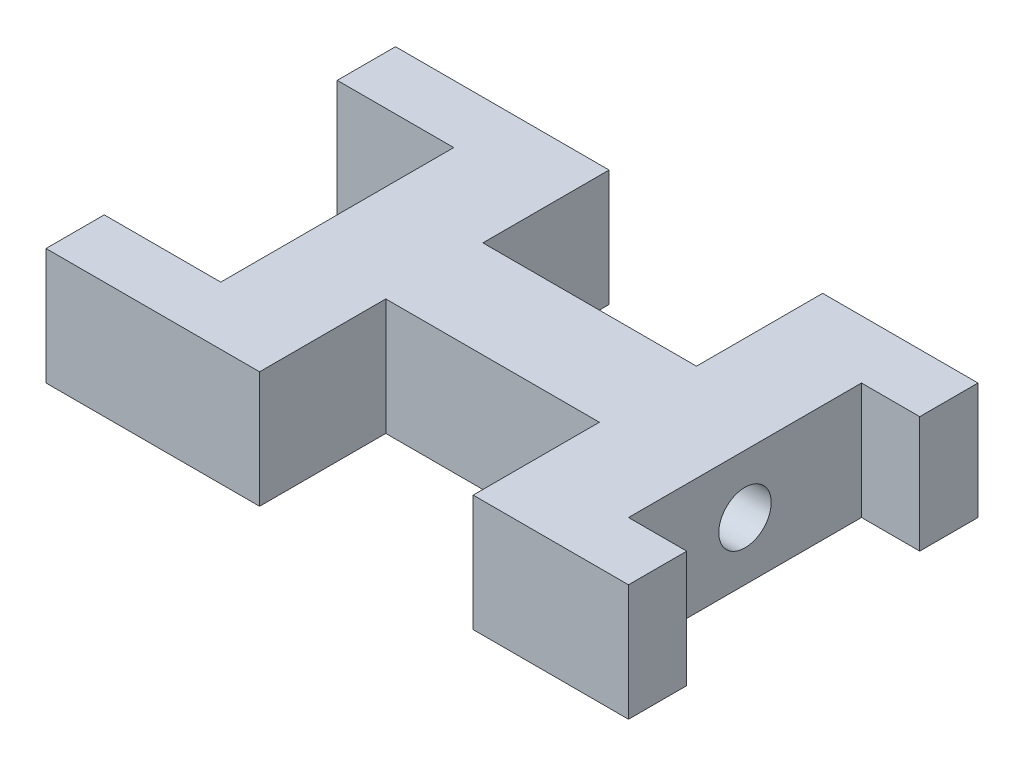
ISO-10303-21;
HEADER;
FILE_DESCRIPTION(('STEP AP214'),'2;1');
FILE_NAME('part.step','',(''),(''),'','','');
FILE_SCHEMA(('AUTOMOTIVE_DESIGN { 1 0 10303 214 1 1 1 1 }'));
ENDSEC;
DATA;
#1=APPLICATION_CONTEXT('core data for automotive mechanical design processes');
#2=APPLICATION_PROTOCOL_DEFINITION('international standard','automotive_design',2000,#1);
#3=PRODUCT_CONTEXT('',#1,'mechanical');
#4=PRODUCT('Part','Part','',(#3));
#5=PRODUCT_RELATED_PRODUCT_CATEGORY('part','',(#4));
#6=PRODUCT_DEFINITION_FORMATION('','',#4);
#7=PRODUCT_DEFINITION_CONTEXT('part definition',#1,'design');
#8=PRODUCT_DEFINITION('design','',#6,#7);
#9=PRODUCT_DEFINITION_SHAPE('','',#8);
#10=(LENGTH_UNIT() NAMED_UNIT(*) SI_UNIT(.MILLI.,.METRE.));
#11=(NAMED_UNIT(*) PLANE_ANGLE_UNIT() SI_UNIT($,.RADIAN.));
#12=(NAMED_UNIT(*) SI_UNIT($,.STERADIAN.) SOLID_ANGLE_UNIT());
#13=UNCERTAINTY_MEASURE_WITH_UNIT(LENGTH_MEASURE(1.E-05),#10,'distance_accuracy_value','');
#14=(GEOMETRIC_REPRESENTATION_CONTEXT(3) GLOBAL_UNCERTAINTY_ASSIGNED_CONTEXT((#13)) GLOBAL_UNIT_ASSIGNED_CONTEXT((#10,
#11,#12)) REPRESENTATION_CONTEXT('',''));
#15=CARTESIAN_POINT('',(0.,0.,0.));
#16=DIRECTION('',(0.,0.,1.));
#17=DIRECTION('',(1.,0.,0.));
#18=AXIS2_PLACEMENT_3D('',#15,#16,#17);
#19=CARTESIAN_POINT('',(-10.5,6.,0.));
#20=DIRECTION('',(1.,0.,0.));
#21=DIRECTION('',(0.,0.,-1.));
#22=AXIS2_PLACEMENT_3D('',#19,#20,#21);
#23=PLANE('',#22);
#24=CARTESIAN_POINT('',(-10.5,3.,0.));
#25=DIRECTION('',(1.,0.,0.));
#26=DIRECTION('',(0.,0.,-1.));
#27=AXIS2_PLACEMENT_3D('',#24,#25,#26);
#28=CIRCLE('',#27,1.35);
#29=CARTESIAN_POINT('',(-10.5,3.,-1.35000000000001));
#30=VERTEX_POINT('',#29);
#31=EDGE_CURVE('E203',#30,#30,#28,.T.);
#32=ORIENTED_EDGE('',*,*,#31,.T.);
#33=EDGE_LOOP('',(#32));
#34=FACE_BOUND('',#33,.T.);
#35=DIRECTION('',(0.,0.,1.));
#36=VECTOR('',#35,1.);
#37=CARTESIAN_POINT('',(-10.5,0.,0.));
#38=LINE('',#37,#36);
#39=CARTESIAN_POINT('',(-10.5,0.,-6.));
#40=VERTEX_POINT('',#39);
#41=CARTESIAN_POINT('',(-10.5,0.,6.));
#42=VERTEX_POINT('',#41);
#43=EDGE_CURVE('E199',#40,#42,#38,.T.);
#44=ORIENTED_EDGE('',*,*,#43,.T.);
#45=DIRECTION('',(0.,-1.,0.));
#46=VECTOR('',#45,1.);
#47=CARTESIAN_POINT('',(-10.5,6.,6.));
#48=LINE('',#47,#46);
#49=CARTESIAN_POINT('',(-10.5,6.,6.));
#50=VERTEX_POINT('',#49);
#51=EDGE_CURVE('E11',#50,#42,#48,.T.);
#52=ORIENTED_EDGE('',*,*,#51,.F.);
#53=DIRECTION('',(0.,0.,1.));
#54=VECTOR('',#53,1.);
#55=CARTESIAN_POINT('',(-10.5,6.,0.));
#56=LINE('',#55,#54);
#57=CARTESIAN_POINT('',(-10.5,6.,-6.));
#58=VERTEX_POINT('',#57);
#59=EDGE_CURVE('E125',#58,#50,#56,.T.);
#60=ORIENTED_EDGE('',*,*,#59,.F.);
#61=DIRECTION('',(0.,-1.,0.));
#62=VECTOR('',#61,1.);
#63=CARTESIAN_POINT('',(-10.5,6.,-6.));
#64=LINE('',#63,#62);
#65=EDGE_CURVE('E195',#58,#40,#64,.T.);
#66=ORIENTED_EDGE('',*,*,#65,.T.);
#67=EDGE_LOOP('',(#44,#52,#60,#66));
#68=FACE_BOUND('',#67,.T.);
#69=ADVANCED_FACE('F33',(#34,#68),#23,.F.);
#70=CARTESIAN_POINT('',(0.,6.,6.));
#71=DIRECTION('',(0.,0.,-1.));
#72=DIRECTION('',(-1.,0.,0.));
#73=AXIS2_PLACEMENT_3D('',#70,#71,#72);
#74=PLANE('',#73);
#75=DIRECTION('',(1.,0.,0.));
#76=VECTOR('',#75,1.);
#77=CARTESIAN_POINT('',(0.,0.,6.));
#78=LINE('',#77,#76);
#79=CARTESIAN_POINT('',(-16.5,0.,6.));
#80=VERTEX_POINT('',#79);
#81=EDGE_CURVE('E202',#80,#42,#78,.T.);
#82=ORIENTED_EDGE('',*,*,#81,.F.);
#83=DIRECTION('',(0.,-1.,0.));
#84=VECTOR('',#83,1.);
#85=CARTESIAN_POINT('',(-16.5,6.,6.));
#86=LINE('',#85,#84);
#87=CARTESIAN_POINT('',(-16.5,6.,6.));
#88=VERTEX_POINT('',#87);
#89=EDGE_CURVE('E41',#88,#80,#86,.T.);
#90=ORIENTED_EDGE('',*,*,#89,.F.);
#91=DIRECTION('',(1.,0.,0.));
#92=VECTOR('',#91,1.);
#93=CARTESIAN_POINT('',(0.,6.,6.));
#94=LINE('',#93,#92);
#95=EDGE_CURVE('E306',#88,#50,#94,.T.);
#96=ORIENTED_EDGE('',*,*,#95,.T.);
#97=ORIENTED_EDGE('',*,*,#51,.T.);
#98=EDGE_LOOP('',(#82,#90,#96,#97));
#99=FACE_BOUND('',#98,.T.);
#100=ADVANCED_FACE('F293',(#99),#74,.T.);
#101=CARTESIAN_POINT('',(-16.5,6.,0.));
#102=DIRECTION('',(-1.,0.,0.));
#103=DIRECTION('',(0.,0.,1.));
#104=AXIS2_PLACEMENT_3D('',#101,#102,#103);
#105=PLANE('',#104);
#106=DIRECTION('',(0.,0.,-1.));
#107=VECTOR('',#106,1.);
#108=CARTESIAN_POINT('',(-16.5,0.,0.));
#109=LINE('',#108,#107);
#110=CARTESIAN_POINT('',(-16.5,0.,9.));
#111=VERTEX_POINT('',#110);
#112=EDGE_CURVE('E206',#111,#80,#109,.T.);
#113=ORIENTED_EDGE('',*,*,#112,.F.);
#114=DIRECTION('',(0.,-1.,0.));
#115=VECTOR('',#114,1.);
#116=CARTESIAN_POINT('',(-16.5,6.,9.));
#117=LINE('',#116,#115);
#118=CARTESIAN_POINT('',(-16.5,6.,9.));
#119=VERTEX_POINT('',#118);
#120=EDGE_CURVE('E283',#119,#111,#117,.T.);
#121=ORIENTED_EDGE('',*,*,#120,.F.);
#122=DIRECTION('',(0.,0.,-1.));
#123=VECTOR('',#122,1.);
#124=CARTESIAN_POINT('',(-16.5,6.,0.));
#125=LINE('',#124,#123);
#126=EDGE_CURVE('E290',#119,#88,#125,.T.);
#127=ORIENTED_EDGE('',*,*,#126,.T.);
#128=ORIENTED_EDGE('',*,*,#89,.T.);
#129=EDGE_LOOP('',(#113,#121,#127,#128));
#130=FACE_BOUND('',#129,.T.);
#131=ADVANCED_FACE('F288',(#130),#105,.T.);
#132=CARTESIAN_POINT('',(0.,6.,9.));
#133=DIRECTION('',(0.,0.,1.));
#134=DIRECTION('',(1.,0.,0.));
#135=AXIS2_PLACEMENT_3D('',#132,#133,#134);
#136=PLANE('',#135);
#137=DIRECTION('',(-1.,0.,0.));
#138=VECTOR('',#137,1.);
#139=CARTESIAN_POINT('',(0.,0.,9.));
#140=LINE('',#139,#138);
#141=CARTESIAN_POINT('',(-5.5,0.,9.));
#142=VERTEX_POINT('',#141);
#143=EDGE_CURVE('E209',#142,#111,#140,.T.);
#144=ORIENTED_EDGE('',*,*,#143,.F.);
#145=DIRECTION('',(0.,-1.,0.));
#146=VECTOR('',#145,1.);
#147=CARTESIAN_POINT('',(-5.5,6.,9.));
#148=LINE('',#147,#146);
#149=CARTESIAN_POINT('',(-5.5,6.,9.));
#150=VERTEX_POINT('',#149);
#151=EDGE_CURVE('E281',#150,#142,#148,.T.);
#152=ORIENTED_EDGE('',*,*,#151,.F.);
#153=DIRECTION('',(-1.,0.,0.));
#154=VECTOR('',#153,1.);
#155=CARTESIAN_POINT('',(0.,6.,9.));
#156=LINE('',#155,#154);
#157=EDGE_CURVE('E303',#150,#119,#156,.T.);
#158=ORIENTED_EDGE('',*,*,#157,.T.);
#159=ORIENTED_EDGE('',*,*,#120,.T.);
#160=EDGE_LOOP('',(#144,#152,#158,#159));
#161=FACE_BOUND('',#160,.T.);
#162=ADVANCED_FACE('F300',(#161),#136,.T.);
#163=CARTESIAN_POINT('',(-5.5,6.,0.));
#164=DIRECTION('',(1.,0.,0.));
#165=DIRECTION('',(0.,0.,-1.));
#166=AXIS2_PLACEMENT_3D('',#163,#164,#165);
#167=PLANE('',#166);
#168=DIRECTION('',(0.,0.,1.));
#169=VECTOR('',#168,1.);
#170=CARTESIAN_POINT('',(-5.5,0.,0.));
#171=LINE('',#170,#169);
#172=CARTESIAN_POINT('',(-5.5,0.,2.5));
#173=VERTEX_POINT('',#172);
#174=EDGE_CURVE('E212',#173,#142,#171,.T.);
#175=ORIENTED_EDGE('',*,*,#174,.F.);
#176=DIRECTION('',(0.,-1.,0.));
#177=VECTOR('',#176,1.);
#178=CARTESIAN_POINT('',(-5.5,6.,2.5));
#179=LINE('',#178,#177);
#180=CARTESIAN_POINT('',(-5.5,6.,2.5));
#181=VERTEX_POINT('',#180);
#182=EDGE_CURVE('E279',#181,#173,#179,.T.);
#183=ORIENTED_EDGE('',*,*,#182,.F.);
#184=DIRECTION('',(0.,0.,1.));
#185=VECTOR('',#184,1.);
#186=CARTESIAN_POINT('',(-5.5,6.,0.));
#187=LINE('',#186,#185);
#188=EDGE_CURVE('E308',#181,#150,#187,.T.);
#189=ORIENTED_EDGE('',*,*,#188,.T.);
#190=ORIENTED_EDGE('',*,*,#151,.T.);
#191=EDGE_LOOP('',(#175,#183,#189,#190));
#192=FACE_BOUND('',#191,.T.);
#193=ADVANCED_FACE('F436',(#192),#167,.T.);
#194=CARTESIAN_POINT('',(0.,6.,2.5));
#195=DIRECTION('',(0.,0.,1.));
#196=DIRECTION('',(1.,0.,0.));
#197=AXIS2_PLACEMENT_3D('',#194,#195,#196);
#198=PLANE('',#197);
#199=DIRECTION('',(-1.,0.,0.));
#200=VECTOR('',#199,1.);
#201=CARTESIAN_POINT('',(0.,0.,2.5));
#202=LINE('',#201,#200);
#203=CARTESIAN_POINT('',(5.5,0.,2.5));
#204=VERTEX_POINT('',#203);
#205=EDGE_CURVE('E215',#204,#173,#202,.T.);
#206=ORIENTED_EDGE('',*,*,#205,.F.);
#207=DIRECTION('',(0.,-1.,0.));
#208=VECTOR('',#207,1.);
#209=CARTESIAN_POINT('',(5.5,6.,2.5));
#210=LINE('',#209,#208);
#211=CARTESIAN_POINT('',(5.5,6.,2.5));
#212=VERTEX_POINT('',#211);
#213=EDGE_CURVE('E277',#212,#204,#210,.T.);
#214=ORIENTED_EDGE('',*,*,#213,.F.);
#215=DIRECTION('',(-1.,0.,0.));
#216=VECTOR('',#215,1.);
#217=CARTESIAN_POINT('',(0.,6.,2.5));
#218=LINE('',#217,#216);
#219=EDGE_CURVE('E314',#212,#181,#218,.T.);
#220=ORIENTED_EDGE('',*,*,#219,.T.);
#221=ORIENTED_EDGE('',*,*,#182,.T.);
#222=EDGE_LOOP('',(#206,#214,#220,#221));
#223=FACE_BOUND('',#222,.T.);
#224=ADVANCED_FACE('F432',(#223),#198,.T.);
#225=CARTESIAN_POINT('',(5.5,6.,0.));
#226=DIRECTION('',(1.,0.,0.));
#227=DIRECTION('',(0.,0.,-1.));
#228=AXIS2_PLACEMENT_3D('',#225,#226,#227);
#229=PLANE('',#228);
#230=DIRECTION('',(0.,0.,1.));
#231=VECTOR('',#230,1.);
#232=CARTESIAN_POINT('',(5.5,0.,0.));
#233=LINE('',#232,#231);
#234=CARTESIAN_POINT('',(5.5,0.,9.));
#235=VERTEX_POINT('',#234);
#236=EDGE_CURVE('E218',#204,#235,#233,.T.);
#237=ORIENTED_EDGE('',*,*,#236,.T.);
#238=DIRECTION('',(0.,-1.,0.));
#239=VECTOR('',#238,1.);
#240=CARTESIAN_POINT('',(5.5,6.,9.));
#241=LINE('',#240,#239);
#242=CARTESIAN_POINT('',(5.5,6.,9.));
#243=VERTEX_POINT('',#242);
#244=EDGE_CURVE('E274',#243,#235,#241,.T.);
#245=ORIENTED_EDGE('',*,*,#244,.F.);
#246=DIRECTION('',(0.,0.,1.));
#247=VECTOR('',#246,1.);
#248=CARTESIAN_POINT('',(5.5,6.,0.));
#249=LINE('',#248,#247);
#250=EDGE_CURVE('E317',#212,#243,#249,.T.);
#251=ORIENTED_EDGE('',*,*,#250,.F.);
#252=ORIENTED_EDGE('',*,*,#213,.T.);
#253=EDGE_LOOP('',(#237,#245,#251,#252));
#254=FACE_BOUND('',#253,.T.);
#255=ADVANCED_FACE('F428',(#254),#229,.F.);
#256=CARTESIAN_POINT('',(0.,6.,9.));
#257=DIRECTION('',(0.,0.,-1.));
#258=DIRECTION('',(-1.,0.,0.));
#259=AXIS2_PLACEMENT_3D('',#256,#257,#258);
#260=PLANE('',#259);
#261=DIRECTION('',(1.,0.,0.));
#262=VECTOR('',#261,1.);
#263=CARTESIAN_POINT('',(0.,0.,9.));
#264=LINE('',#263,#262);
#265=CARTESIAN_POINT('',(13.5,0.,9.));
#266=VERTEX_POINT('',#265);
#267=EDGE_CURVE('E220',#235,#266,#264,.T.);
#268=ORIENTED_EDGE('',*,*,#267,.T.);
#269=DIRECTION('',(0.,-1.,0.));
#270=VECTOR('',#269,1.);
#271=CARTESIAN_POINT('',(13.5,6.,9.));
#272=LINE('',#271,#270);
#273=CARTESIAN_POINT('',(13.5,6.,9.));
#274=VERTEX_POINT('',#273);
#275=EDGE_CURVE('E271',#274,#266,#272,.T.);
#276=ORIENTED_EDGE('',*,*,#275,.F.);
#277=DIRECTION('',(1.,0.,0.));
#278=VECTOR('',#277,1.);
#279=CARTESIAN_POINT('',(0.,6.,9.));
#280=LINE('',#279,#278);
#281=EDGE_CURVE('E319',#243,#274,#280,.T.);
#282=ORIENTED_EDGE('',*,*,#281,.F.);
#283=ORIENTED_EDGE('',*,*,#244,.T.);
#284=EDGE_LOOP('',(#268,#276,#282,#283));
#285=FACE_BOUND('',#284,.T.);
#286=ADVANCED_FACE('F424',(#285),#260,.F.);
#287=CARTESIAN_POINT('',(13.5,6.,0.));
#288=DIRECTION('',(-1.,0.,0.));
#289=DIRECTION('',(0.,0.,1.));
#290=AXIS2_PLACEMENT_3D('',#287,#288,#289);
#291=PLANE('',#290);
#292=DIRECTION('',(0.,0.,-1.));
#293=VECTOR('',#292,1.);
#294=CARTESIAN_POINT('',(13.5,0.,0.));
#295=LINE('',#294,#293);
#296=CARTESIAN_POINT('',(13.5,0.,6.));
#297=VERTEX_POINT('',#296);
#298=EDGE_CURVE('E222',#266,#297,#295,.T.);
#299=ORIENTED_EDGE('',*,*,#298,.T.);
#300=DIRECTION('',(0.,-1.,0.));
#301=VECTOR('',#300,1.);
#302=CARTESIAN_POINT('',(13.5,6.,6.));
#303=LINE('',#302,#301);
#304=CARTESIAN_POINT('',(13.5,6.,6.));
#305=VERTEX_POINT('',#304);
#306=EDGE_CURVE('E268',#305,#297,#303,.T.);
#307=ORIENTED_EDGE('',*,*,#306,.F.);
#308=DIRECTION('',(0.,0.,-1.));
#309=VECTOR('',#308,1.);
#310=CARTESIAN_POINT('',(13.5,6.,0.));
#311=LINE('',#310,#309);
#312=EDGE_CURVE('E321',#274,#305,#311,.T.);
#313=ORIENTED_EDGE('',*,*,#312,.F.);
#314=ORIENTED_EDGE('',*,*,#275,.T.);
#315=EDGE_LOOP('',(#299,#307,#313,#314));
#316=FACE_BOUND('',#315,.T.);
#317=ADVANCED_FACE('F420',(#316),#291,.F.);
#318=CARTESIAN_POINT('',(0.,6.,6.));
#319=DIRECTION('',(0.,0.,1.));
#320=DIRECTION('',(1.,0.,0.));
#321=AXIS2_PLACEMENT_3D('',#318,#319,#320);
#322=PLANE('',#321);
#323=DIRECTION('',(-1.,0.,0.));
#324=VECTOR('',#323,1.);
#325=CARTESIAN_POINT('',(0.,0.,6.));
#326=LINE('',#325,#324);
#327=CARTESIAN_POINT('',(10.5,0.,6.));
#328=VERTEX_POINT('',#327);
#329=EDGE_CURVE('E224',#297,#328,#326,.T.);
#330=ORIENTED_EDGE('',*,*,#329,.T.);
#331=DIRECTION('',(0.,-1.,0.));
#332=VECTOR('',#331,1.);
#333=CARTESIAN_POINT('',(10.5,6.,6.));
#334=LINE('',#333,#332);
#335=CARTESIAN_POINT('',(10.5,6.,6.));
#336=VERTEX_POINT('',#335);
#337=EDGE_CURVE('E265',#336,#328,#334,.T.);
#338=ORIENTED_EDGE('',*,*,#337,.F.);
#339=DIRECTION('',(-1.,0.,0.));
#340=VECTOR('',#339,1.);
#341=CARTESIAN_POINT('',(0.,6.,6.));
#342=LINE('',#341,#340);
#343=EDGE_CURVE('E323',#305,#336,#342,.T.);
#344=ORIENTED_EDGE('',*,*,#343,.F.);
#345=ORIENTED_EDGE('',*,*,#306,.T.);
#346=EDGE_LOOP('',(#330,#338,#344,#345));
#347=FACE_BOUND('',#346,.T.);
#348=ADVANCED_FACE('F376',(#347),#322,.F.);
#349=CARTESIAN_POINT('',(10.5,6.,0.));
#350=DIRECTION('',(-1.,0.,0.));
#351=DIRECTION('',(0.,0.,1.));
#352=AXIS2_PLACEMENT_3D('',#349,#350,#351);
#353=PLANE('',#352);
#354=CARTESIAN_POINT('',(10.5,3.,0.));
#355=DIRECTION('',(1.,0.,0.));
#356=DIRECTION('',(0.,0.,-1.));
#357=AXIS2_PLACEMENT_3D('',#354,#355,#356);
#358=CIRCLE('',#357,1.35);
#359=CARTESIAN_POINT('',(10.5,3.,-1.35));
#360=VERTEX_POINT('',#359);
#361=EDGE_CURVE('E365',#360,#360,#358,.T.);
#362=ORIENTED_EDGE('',*,*,#361,.F.);
#363=EDGE_LOOP('',(#362));
#364=FACE_BOUND('',#363,.T.);
#365=DIRECTION('',(0.,0.,-1.));
#366=VECTOR('',#365,1.);
#367=CARTESIAN_POINT('',(10.5,0.,0.));
#368=LINE('',#367,#366);
#369=CARTESIAN_POINT('',(10.5,0.,-6.00000000000001));
#370=VERTEX_POINT('',#369);
#371=EDGE_CURVE('E226',#328,#370,#368,.T.);
#372=ORIENTED_EDGE('',*,*,#371,.T.);
#373=DIRECTION('',(0.,-1.,0.));
#374=VECTOR('',#373,1.);
#375=CARTESIAN_POINT('',(10.5,6.,-6.00000000000001));
#376=LINE('',#375,#374);
#377=CARTESIAN_POINT('',(10.5,6.,-6.00000000000001));
#378=VERTEX_POINT('',#377);
#379=EDGE_CURVE('E263',#378,#370,#376,.T.);
#380=ORIENTED_EDGE('',*,*,#379,.F.);
#381=DIRECTION('',(0.,0.,-1.));
#382=VECTOR('',#381,1.);
#383=CARTESIAN_POINT('',(10.5,6.,0.));
#384=LINE('',#383,#382);
#385=EDGE_CURVE('E325',#336,#378,#384,.T.);
#386=ORIENTED_EDGE('',*,*,#385,.F.);
#387=ORIENTED_EDGE('',*,*,#337,.T.);
#388=EDGE_LOOP('',(#372,#380,#386,#387));
#389=FACE_BOUND('',#388,.T.);
#390=ADVANCED_FACE('F373',(#364,#389),#353,.F.);
#391=CARTESIAN_POINT('',(0.,6.,-6.00000000000001));
#392=DIRECTION('',(0.,0.,1.));
#393=DIRECTION('',(1.,0.,0.));
#394=AXIS2_PLACEMENT_3D('',#391,#392,#393);
#395=PLANE('',#394);
#396=DIRECTION('',(-1.,0.,0.));
#397=VECTOR('',#396,1.);
#398=CARTESIAN_POINT('',(0.,0.,-6.00000000000001));
#399=LINE('',#398,#397);
#400=CARTESIAN_POINT('',(13.5,0.,-6.));
#401=VERTEX_POINT('',#400);
#402=EDGE_CURVE('E229',#401,#370,#399,.T.);
#403=ORIENTED_EDGE('',*,*,#402,.F.);
#404=DIRECTION('',(0.,-1.,0.));
#405=VECTOR('',#404,1.);
#406=CARTESIAN_POINT('',(13.5,6.,-6.));
#407=LINE('',#406,#405);
#408=CARTESIAN_POINT('',(13.5,6.,-6.));
#409=VERTEX_POINT('',#408);
#410=EDGE_CURVE('E261',#409,#401,#407,.T.);
#411=ORIENTED_EDGE('',*,*,#410,.F.);
#412=DIRECTION('',(-1.,0.,0.));
#413=VECTOR('',#412,1.);
#414=CARTESIAN_POINT('',(0.,6.,-6.00000000000001));
#415=LINE('',#414,#413);
#416=EDGE_CURVE('E327',#409,#378,#415,.T.);
#417=ORIENTED_EDGE('',*,*,#416,.T.);
#418=ORIENTED_EDGE('',*,*,#379,.T.);
#419=EDGE_LOOP('',(#403,#411,#417,#418));
#420=FACE_BOUND('',#419,.T.);
#421=ADVANCED_FACE('F375',(#420),#395,.T.);
#422=CARTESIAN_POINT('',(13.5,6.,0.));
#423=DIRECTION('',(1.,0.,0.));
#424=DIRECTION('',(0.,0.,-1.));
#425=AXIS2_PLACEMENT_3D('',#422,#423,#424);
#426=PLANE('',#425);
#427=DIRECTION('',(0.,0.,1.));
#428=VECTOR('',#427,1.);
#429=CARTESIAN_POINT('',(13.5,0.,0.));
#430=LINE('',#429,#428);
#431=CARTESIAN_POINT('',(13.5,0.,-9.00000000000001));
#432=VERTEX_POINT('',#431);
#433=EDGE_CURVE('E232',#432,#401,#430,.T.);
#434=ORIENTED_EDGE('',*,*,#433,.F.);
#435=DIRECTION('',(0.,-1.,0.));
#436=VECTOR('',#435,1.);
#437=CARTESIAN_POINT('',(13.5,6.,-9.00000000000001));
#438=LINE('',#437,#436);
#439=CARTESIAN_POINT('',(13.5,6.,-9.00000000000001));
#440=VERTEX_POINT('',#439);
#441=EDGE_CURVE('E259',#440,#432,#438,.T.);
#442=ORIENTED_EDGE('',*,*,#441,.F.);
#443=DIRECTION('',(0.,0.,1.));
#444=VECTOR('',#443,1.);
#445=CARTESIAN_POINT('',(13.5,6.,0.));
#446=LINE('',#445,#444);
#447=EDGE_CURVE('E330',#440,#409,#446,.T.);
#448=ORIENTED_EDGE('',*,*,#447,.T.);
#449=ORIENTED_EDGE('',*,*,#410,.T.);
#450=EDGE_LOOP('',(#434,#442,#448,#449));
#451=FACE_BOUND('',#450,.T.);
#452=ADVANCED_FACE('F390',(#451),#426,.T.);
#453=CARTESIAN_POINT('',(0.,6.,-9.00000000000001));
#454=DIRECTION('',(0.,0.,-1.));
#455=DIRECTION('',(-1.,0.,0.));
#456=AXIS2_PLACEMENT_3D('',#453,#454,#455);
#457=PLANE('',#456);
#458=DIRECTION('',(1.,0.,0.));
#459=VECTOR('',#458,1.);
#460=CARTESIAN_POINT('',(0.,0.,-9.00000000000001));
#461=LINE('',#460,#459);
#462=CARTESIAN_POINT('',(5.5,0.,-9.00000000000001));
#463=VERTEX_POINT('',#462);
#464=EDGE_CURVE('E235',#463,#432,#461,.T.);
#465=ORIENTED_EDGE('',*,*,#464,.F.);
#466=DIRECTION('',(0.,-1.,0.));
#467=VECTOR('',#466,1.);
#468=CARTESIAN_POINT('',(5.5,6.,-9.00000000000001));
#469=LINE('',#468,#467);
#470=CARTESIAN_POINT('',(5.5,6.,-9.00000000000001));
#471=VERTEX_POINT('',#470);
#472=EDGE_CURVE('E257',#471,#463,#469,.T.);
#473=ORIENTED_EDGE('',*,*,#472,.F.);
#474=DIRECTION('',(1.,0.,0.));
#475=VECTOR('',#474,1.);
#476=CARTESIAN_POINT('',(0.,6.,-9.00000000000001));
#477=LINE('',#476,#475);
#478=EDGE_CURVE('E333',#471,#440,#477,.T.);
#479=ORIENTED_EDGE('',*,*,#478,.T.);
#480=ORIENTED_EDGE('',*,*,#441,.T.);
#481=EDGE_LOOP('',(#465,#473,#479,#480));
#482=FACE_BOUND('',#481,.T.);
#483=ADVANCED_FACE('F393',(#482),#457,.T.);
#484=CARTESIAN_POINT('',(5.5,6.,0.));
#485=DIRECTION('',(1.,0.,0.));
#486=DIRECTION('',(0.,0.,-1.));
#487=AXIS2_PLACEMENT_3D('',#484,#485,#486);
#488=PLANE('',#487);
#489=DIRECTION('',(0.,0.,1.));
#490=VECTOR('',#489,1.);
#491=CARTESIAN_POINT('',(5.5,0.,0.));
#492=LINE('',#491,#490);
#493=CARTESIAN_POINT('',(5.5,0.,-2.5));
#494=VERTEX_POINT('',#493);
#495=EDGE_CURVE('E238',#463,#494,#492,.T.);
#496=ORIENTED_EDGE('',*,*,#495,.T.);
#497=DIRECTION('',(0.,-1.,0.));
#498=VECTOR('',#497,1.);
#499=CARTESIAN_POINT('',(5.5,6.,-2.5));
#500=LINE('',#499,#498);
#501=CARTESIAN_POINT('',(5.5,6.,-2.5));
#502=VERTEX_POINT('',#501);
#503=EDGE_CURVE('E254',#502,#494,#500,.T.);
#504=ORIENTED_EDGE('',*,*,#503,.F.);
#505=DIRECTION('',(0.,0.,1.));
#506=VECTOR('',#505,1.);
#507=CARTESIAN_POINT('',(5.5,6.,0.));
#508=LINE('',#507,#506);
#509=EDGE_CURVE('E336',#471,#502,#508,.T.);
#510=ORIENTED_EDGE('',*,*,#509,.F.);
#511=ORIENTED_EDGE('',*,*,#472,.T.);
#512=EDGE_LOOP('',(#496,#504,#510,#511));
#513=FACE_BOUND('',#512,.T.);
#514=ADVANCED_FACE('F398',(#513),#488,.F.);
#515=CARTESIAN_POINT('',(0.,6.,-2.5));
#516=DIRECTION('',(0.,0.,1.));
#517=DIRECTION('',(1.,0.,0.));
#518=AXIS2_PLACEMENT_3D('',#515,#516,#517);
#519=PLANE('',#518);
#520=DIRECTION('',(-1.,0.,0.));
#521=VECTOR('',#520,1.);
#522=CARTESIAN_POINT('',(0.,0.,-2.5));
#523=LINE('',#522,#521);
#524=CARTESIAN_POINT('',(-5.5,0.,-2.5));
#525=VERTEX_POINT('',#524);
#526=EDGE_CURVE('E240',#494,#525,#523,.T.);
#527=ORIENTED_EDGE('',*,*,#526,.T.);
#528=DIRECTION('',(0.,-1.,0.));
#529=VECTOR('',#528,1.);
#530=CARTESIAN_POINT('',(-5.5,6.,-2.5));
#531=LINE('',#530,#529);
#532=CARTESIAN_POINT('',(-5.5,6.,-2.5));
#533=VERTEX_POINT('',#532);
#534=EDGE_CURVE('E252',#533,#525,#531,.T.);
#535=ORIENTED_EDGE('',*,*,#534,.F.);
#536=DIRECTION('',(-1.,0.,0.));
#537=VECTOR('',#536,1.);
#538=CARTESIAN_POINT('',(0.,6.,-2.5));
#539=LINE('',#538,#537);
#540=EDGE_CURVE('E338',#502,#533,#539,.T.);
#541=ORIENTED_EDGE('',*,*,#540,.F.);
#542=ORIENTED_EDGE('',*,*,#503,.T.);
#543=EDGE_LOOP('',(#527,#535,#541,#542));
#544=FACE_BOUND('',#543,.T.);
#545=ADVANCED_FACE('F401',(#544),#519,.F.);
#546=CARTESIAN_POINT('',(-5.5,6.,0.));
#547=DIRECTION('',(1.,0.,0.));
#548=DIRECTION('',(0.,0.,-1.));
#549=AXIS2_PLACEMENT_3D('',#546,#547,#548);
#550=PLANE('',#549);
#551=DIRECTION('',(0.,0.,1.));
#552=VECTOR('',#551,1.);
#553=CARTESIAN_POINT('',(-5.5,0.,0.));
#554=LINE('',#553,#552);
#555=CARTESIAN_POINT('',(-5.5,0.,-9.));
#556=VERTEX_POINT('',#555);
#557=EDGE_CURVE('E243',#556,#525,#554,.T.);
#558=ORIENTED_EDGE('',*,*,#557,.F.);
#559=DIRECTION('',(0.,-1.,0.));
#560=VECTOR('',#559,1.);
#561=CARTESIAN_POINT('',(-5.5,6.,-9.));
#562=LINE('',#561,#560);
#563=CARTESIAN_POINT('',(-5.5,6.,-9.));
#564=VERTEX_POINT('',#563);
#565=EDGE_CURVE('E190',#564,#556,#562,.T.);
#566=ORIENTED_EDGE('',*,*,#565,.F.);
#567=DIRECTION('',(0.,0.,1.));
#568=VECTOR('',#567,1.);
#569=CARTESIAN_POINT('',(-5.5,6.,0.));
#570=LINE('',#569,#568);
#571=EDGE_CURVE('E183',#564,#533,#570,.T.);
#572=ORIENTED_EDGE('',*,*,#571,.T.);
#573=ORIENTED_EDGE('',*,*,#534,.T.);
#574=EDGE_LOOP('',(#558,#566,#572,#573));
#575=FACE_BOUND('',#574,.T.);
#576=ADVANCED_FACE('F341',(#575),#550,.T.);
#577=CARTESIAN_POINT('',(0.,6.,-9.));
#578=DIRECTION('',(0.,0.,1.));
#579=DIRECTION('',(1.,0.,0.));
#580=AXIS2_PLACEMENT_3D('',#577,#578,#579);
#581=PLANE('',#580);
#582=DIRECTION('',(-1.,0.,0.));
#583=VECTOR('',#582,1.);
#584=CARTESIAN_POINT('',(0.,0.,-9.));
#585=LINE('',#584,#583);
#586=CARTESIAN_POINT('',(-16.5,0.,-9.));
#587=VERTEX_POINT('',#586);
#588=EDGE_CURVE('E189',#556,#587,#585,.T.);
#589=ORIENTED_EDGE('',*,*,#588,.T.);
#590=DIRECTION('',(0.,-1.,0.));
#591=VECTOR('',#590,1.);
#592=CARTESIAN_POINT('',(-16.5,6.,-9.));
#593=LINE('',#592,#591);
#594=CARTESIAN_POINT('',(-16.5,6.,-9.));
#595=VERTEX_POINT('',#594);
#596=EDGE_CURVE('E186',#595,#587,#593,.T.);
#597=ORIENTED_EDGE('',*,*,#596,.F.);
#598=DIRECTION('',(-1.,0.,0.));
#599=VECTOR('',#598,1.);
#600=CARTESIAN_POINT('',(0.,6.,-9.));
#601=LINE('',#600,#599);
#602=EDGE_CURVE('E177',#564,#595,#601,.T.);
#603=ORIENTED_EDGE('',*,*,#602,.F.);
#604=ORIENTED_EDGE('',*,*,#565,.T.);
#605=EDGE_LOOP('',(#589,#597,#603,#604));
#606=FACE_BOUND('',#605,.T.);
#607=ADVANCED_FACE('F187',(#606),#581,.F.);
#608=CARTESIAN_POINT('',(-16.5,6.,0.));
#609=DIRECTION('',(1.,0.,0.));
#610=DIRECTION('',(0.,0.,-1.));
#611=AXIS2_PLACEMENT_3D('',#608,#609,#610);
#612=PLANE('',#611);
#613=DIRECTION('',(0.,0.,1.));
#614=VECTOR('',#613,1.);
#615=CARTESIAN_POINT('',(-16.5,0.,0.));
#616=LINE('',#615,#614);
#617=CARTESIAN_POINT('',(-16.5,0.,-6.));
#618=VERTEX_POINT('',#617);
#619=EDGE_CURVE('E113',#587,#618,#616,.T.);
#620=ORIENTED_EDGE('',*,*,#619,.T.);
#621=DIRECTION('',(0.,-1.,0.));
#622=VECTOR('',#621,1.);
#623=CARTESIAN_POINT('',(-16.5,6.,-6.));
#624=LINE('',#623,#622);
#625=CARTESIAN_POINT('',(-16.5,6.,-6.));
#626=VERTEX_POINT('',#625);
#627=EDGE_CURVE('E191',#626,#618,#624,.T.);
#628=ORIENTED_EDGE('',*,*,#627,.F.);
#629=DIRECTION('',(0.,0.,1.));
#630=VECTOR('',#629,1.);
#631=CARTESIAN_POINT('',(-16.5,6.,0.));
#632=LINE('',#631,#630);
#633=EDGE_CURVE('E181',#595,#626,#632,.T.);
#634=ORIENTED_EDGE('',*,*,#633,.F.);
#635=ORIENTED_EDGE('',*,*,#596,.T.);
#636=EDGE_LOOP('',(#620,#628,#634,#635));
#637=FACE_BOUND('',#636,.T.);
#638=ADVANCED_FACE('F193',(#637),#612,.F.);
#639=CARTESIAN_POINT('',(0.,6.,-5.99999999999999));
#640=DIRECTION('',(0.,0.,-1.));
#641=DIRECTION('',(-1.,0.,0.));
#642=AXIS2_PLACEMENT_3D('',#639,#640,#641);
#643=PLANE('',#642);
#644=DIRECTION('',(1.,0.,0.));
#645=VECTOR('',#644,1.);
#646=CARTESIAN_POINT('',(0.,0.,-5.99999999999999));
#647=LINE('',#646,#645);
#648=EDGE_CURVE('E119',#618,#40,#647,.T.);
#649=ORIENTED_EDGE('',*,*,#648,.T.);
#650=ORIENTED_EDGE('',*,*,#65,.F.);
#651=DIRECTION('',(1.,0.,0.));
#652=VECTOR('',#651,1.);
#653=CARTESIAN_POINT('',(0.,6.,-5.99999999999999));
#654=LINE('',#653,#652);
#655=EDGE_CURVE('E49',#626,#58,#654,.T.);
#656=ORIENTED_EDGE('',*,*,#655,.F.);
#657=ORIENTED_EDGE('',*,*,#627,.T.);
#658=EDGE_LOOP('',(#649,#650,#656,#657));
#659=FACE_BOUND('',#658,.T.);
#660=ADVANCED_FACE('F345',(#659),#643,.F.);
#661=CARTESIAN_POINT('',(0.,6.,0.));
#662=DIRECTION('',(0.,1.,0.));
#663=DIRECTION('',(0.,0.,1.));
#664=AXIS2_PLACEMENT_3D('',#661,#662,#663);
#665=PLANE('',#664);
#666=ORIENTED_EDGE('',*,*,#59,.T.);
#667=ORIENTED_EDGE('',*,*,#95,.F.);
#668=ORIENTED_EDGE('',*,*,#126,.F.);
#669=ORIENTED_EDGE('',*,*,#157,.F.);
#670=ORIENTED_EDGE('',*,*,#188,.F.);
#671=ORIENTED_EDGE('',*,*,#219,.F.);
#672=ORIENTED_EDGE('',*,*,#250,.T.);
#673=ORIENTED_EDGE('',*,*,#281,.T.);
#674=ORIENTED_EDGE('',*,*,#312,.T.);
#675=ORIENTED_EDGE('',*,*,#343,.T.);
#676=ORIENTED_EDGE('',*,*,#385,.T.);
#677=ORIENTED_EDGE('',*,*,#416,.F.);
#678=ORIENTED_EDGE('',*,*,#447,.F.);
#679=ORIENTED_EDGE('',*,*,#478,.F.);
#680=ORIENTED_EDGE('',*,*,#509,.T.);
#681=ORIENTED_EDGE('',*,*,#540,.T.);
#682=ORIENTED_EDGE('',*,*,#571,.F.);
#683=ORIENTED_EDGE('',*,*,#602,.T.);
#684=ORIENTED_EDGE('',*,*,#633,.T.);
#685=ORIENTED_EDGE('',*,*,#655,.T.);
#686=EDGE_LOOP('',(#666,#667,#668,#669,#670,#671,#672,#673,#674,#675,#676,#677,#678,#679,#680,
#681,#682,#683,#684,#685));
#687=FACE_BOUND('',#686,.T.);
#688=ADVANCED_FACE('F179',(#687),#665,.T.);
#689=CARTESIAN_POINT('',(0.,0.,0.));
#690=DIRECTION('',(0.,1.,0.));
#691=DIRECTION('',(0.,0.,1.));
#692=AXIS2_PLACEMENT_3D('',#689,#690,#691);
#693=PLANE('',#692);
#694=ORIENTED_EDGE('',*,*,#43,.F.);
#695=ORIENTED_EDGE('',*,*,#648,.F.);
#696=ORIENTED_EDGE('',*,*,#619,.F.);
#697=ORIENTED_EDGE('',*,*,#588,.F.);
#698=ORIENTED_EDGE('',*,*,#557,.T.);
#699=ORIENTED_EDGE('',*,*,#526,.F.);
#700=ORIENTED_EDGE('',*,*,#495,.F.);
#701=ORIENTED_EDGE('',*,*,#464,.T.);
#702=ORIENTED_EDGE('',*,*,#433,.T.);
#703=ORIENTED_EDGE('',*,*,#402,.T.);
#704=ORIENTED_EDGE('',*,*,#371,.F.);
#705=ORIENTED_EDGE('',*,*,#329,.F.);
#706=ORIENTED_EDGE('',*,*,#298,.F.);
#707=ORIENTED_EDGE('',*,*,#267,.F.);
#708=ORIENTED_EDGE('',*,*,#236,.F.);
#709=ORIENTED_EDGE('',*,*,#205,.T.);
#710=ORIENTED_EDGE('',*,*,#174,.T.);
#711=ORIENTED_EDGE('',*,*,#143,.T.);
#712=ORIENTED_EDGE('',*,*,#112,.T.);
#713=ORIENTED_EDGE('',*,*,#81,.T.);
#714=EDGE_LOOP('',(#694,#695,#696,#697,#698,#699,#700,#701,#702,#703,#704,#705,#706,#707,#708,
#709,#710,#711,#712,#713));
#715=FACE_BOUND('',#714,.T.);
#716=ADVANCED_FACE('F296',(#715),#693,.F.);
#717=CARTESIAN_POINT('',(-16.5,3.,0.));
#718=DIRECTION('',(1.,0.,0.));
#719=DIRECTION('',(0.,0.,-1.));
#720=AXIS2_PLACEMENT_3D('',#717,#718,#719);
#721=CYLINDRICAL_SURFACE('',#720,1.35);
#722=ORIENTED_EDGE('',*,*,#361,.T.);
#723=EDGE_LOOP('',(#722));
#724=FACE_BOUND('',#723,.T.);
#725=ORIENTED_EDGE('',*,*,#31,.F.);
#726=EDGE_LOOP('',(#725));
#727=FACE_BOUND('',#726,.T.);
#728=ADVANCED_FACE('F371',(#724,#727),#721,.F.);
#729=CLOSED_SHELL('',(#69,#100,#131,#162,#193,#224,#255,#286,#317,#348,#390,#421,#452,#483,#514,
#545,#576,#607,#638,#660,#688,#716,#728));
#730=MANIFOLD_SOLID_BREP('B2',#729);
#731=ADVANCED_BREP_SHAPE_REPRESENTATION('',(#18,#730),#14);
#732=SHAPE_DEFINITION_REPRESENTATION(#9,#731);
ENDSEC;
END-ISO-10303-21;
